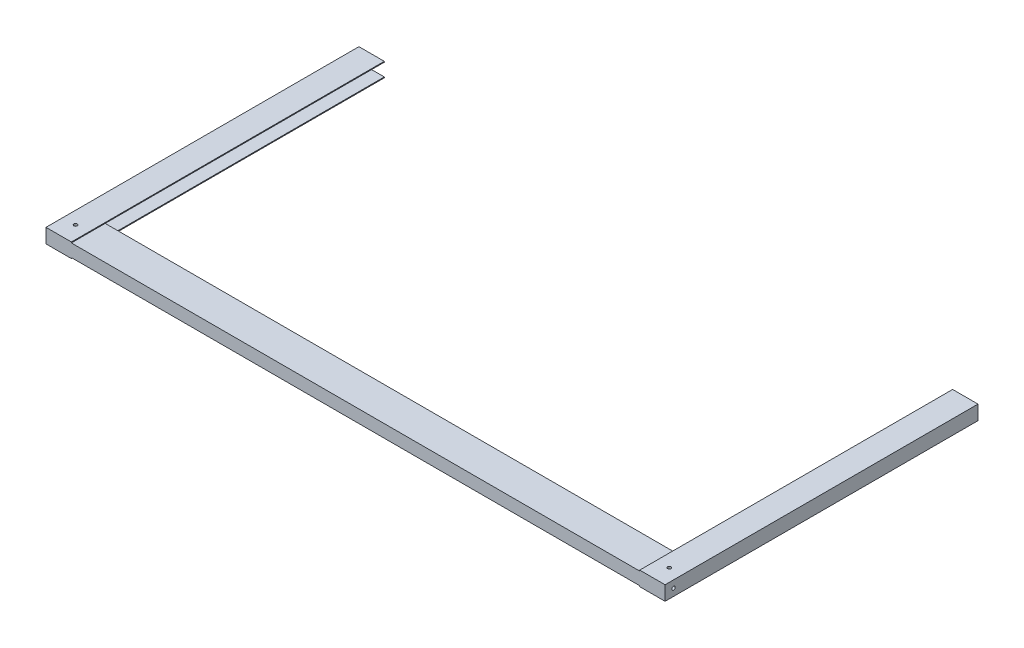
ISO-10303-21;
HEADER;
FILE_DESCRIPTION(('STEP AP214'),'2;1');
FILE_NAME('part.step','',(''),(''),'','','');
FILE_SCHEMA(('AUTOMOTIVE_DESIGN { 1 0 10303 214 1 1 1 1 }'));
ENDSEC;
DATA;
#1=APPLICATION_CONTEXT('core data for automotive mechanical design processes');
#2=APPLICATION_PROTOCOL_DEFINITION('international standard','automotive_design',2000,#1);
#3=PRODUCT_CONTEXT('',#1,'mechanical');
#4=PRODUCT('Part','Part','',(#3));
#5=PRODUCT_RELATED_PRODUCT_CATEGORY('part','',(#4));
#6=PRODUCT_DEFINITION_FORMATION('','',#4);
#7=PRODUCT_DEFINITION_CONTEXT('part definition',#1,'design');
#8=PRODUCT_DEFINITION('design','',#6,#7);
#9=PRODUCT_DEFINITION_SHAPE('','',#8);
#10=(LENGTH_UNIT() NAMED_UNIT(*) SI_UNIT(.MILLI.,.METRE.));
#11=(NAMED_UNIT(*) PLANE_ANGLE_UNIT() SI_UNIT($,.RADIAN.));
#12=(NAMED_UNIT(*) SI_UNIT($,.STERADIAN.) SOLID_ANGLE_UNIT());
#13=UNCERTAINTY_MEASURE_WITH_UNIT(LENGTH_MEASURE(1.E-05),#10,'distance_accuracy_value','');
#14=(GEOMETRIC_REPRESENTATION_CONTEXT(3) GLOBAL_UNCERTAINTY_ASSIGNED_CONTEXT((#13)) GLOBAL_UNIT_ASSIGNED_CONTEXT((#10,
#11,#12)) REPRESENTATION_CONTEXT('',''));
#15=CARTESIAN_POINT('',(0.,0.,0.));
#16=DIRECTION('',(0.,0.,1.));
#17=DIRECTION('',(1.,0.,0.));
#18=AXIS2_PLACEMENT_3D('',#15,#16,#17);
#19=CARTESIAN_POINT('',(-365.000000000001,7.50000000000001,40.));
#20=DIRECTION('',(0.,-1.,0.));
#21=DIRECTION('',(0.,0.,-1.));
#22=AXIS2_PLACEMENT_3D('',#19,#20,#21);
#23=PLANE('',#22);
#24=DIRECTION('',(-1.,0.,0.));
#25=VECTOR('',#24,1.);
#26=CARTESIAN_POINT('',(-365.000000000001,7.50000000000001,40.));
#27=LINE('',#26,#25);
#28=CARTESIAN_POINT('',(335.999999999999,7.50000000000001,40.));
#29=VERTEX_POINT('',#28);
#30=CARTESIAN_POINT('',(-336.000000000001,7.50000000000001,40.));
#31=VERTEX_POINT('',#30);
#32=EDGE_CURVE('E41',#29,#31,#27,.T.);
#33=ORIENTED_EDGE('',*,*,#32,.F.);
#34=DIRECTION('',(0.,0.,1.));
#35=VECTOR('',#34,1.);
#36=CARTESIAN_POINT('',(335.999999999999,7.50000000000001,-330.));
#37=LINE('',#36,#35);
#38=CARTESIAN_POINT('',(335.999999999999,7.50000000000001,0.));
#39=VERTEX_POINT('',#38);
#40=EDGE_CURVE('E227',#39,#29,#37,.T.);
#41=ORIENTED_EDGE('',*,*,#40,.F.);
#42=DIRECTION('',(-1.,0.,0.));
#43=VECTOR('',#42,1.);
#44=CARTESIAN_POINT('',(-365.000000000001,7.50000000000001,0.));
#45=LINE('',#44,#43);
#46=CARTESIAN_POINT('',(-336.000000000001,7.50000000000001,0.));
#47=VERTEX_POINT('',#46);
#48=EDGE_CURVE('E303',#39,#47,#45,.T.);
#49=ORIENTED_EDGE('',*,*,#48,.T.);
#50=DIRECTION('',(0.,0.,1.));
#51=VECTOR('',#50,1.);
#52=CARTESIAN_POINT('',(-336.000000000001,7.50000000000001,-330.));
#53=LINE('',#52,#51);
#54=EDGE_CURVE('E278',#47,#31,#53,.T.);
#55=ORIENTED_EDGE('',*,*,#54,.T.);
#56=EDGE_LOOP('',(#33,#41,#49,#55));
#57=FACE_BOUND('',#56,.T.);
#58=ADVANCED_FACE('F33',(#57),#23,.F.);
#59=CARTESIAN_POINT('',(-365.000000000001,-7.50000000000001,40.));
#60=DIRECTION('',(0.,1.,0.));
#61=DIRECTION('',(0.,0.,1.));
#62=AXIS2_PLACEMENT_3D('',#59,#60,#61);
#63=PLANE('',#62);
#64=DIRECTION('',(1.,0.,0.));
#65=VECTOR('',#64,1.);
#66=CARTESIAN_POINT('',(-365.000000000001,-7.50000000000001,0.));
#67=LINE('',#66,#65);
#68=CARTESIAN_POINT('',(-336.000000000001,-7.50000000000001,0.));
#69=VERTEX_POINT('',#68);
#70=CARTESIAN_POINT('',(335.999999999999,-7.50000000000001,0.));
#71=VERTEX_POINT('',#70);
#72=EDGE_CURVE('E307',#69,#71,#67,.T.);
#73=ORIENTED_EDGE('',*,*,#72,.T.);
#74=DIRECTION('',(0.,0.,1.));
#75=VECTOR('',#74,1.);
#76=CARTESIAN_POINT('',(335.999999999999,-7.50000000000001,-330.));
#77=LINE('',#76,#75);
#78=CARTESIAN_POINT('',(335.999999999999,-7.50000000000001,40.));
#79=VERTEX_POINT('',#78);
#80=EDGE_CURVE('E49',#71,#79,#77,.T.);
#81=ORIENTED_EDGE('',*,*,#80,.T.);
#82=DIRECTION('',(1.,0.,0.));
#83=VECTOR('',#82,1.);
#84=CARTESIAN_POINT('',(-365.000000000001,-7.50000000000001,40.));
#85=LINE('',#84,#83);
#86=CARTESIAN_POINT('',(-336.000000000001,-7.50000000000001,40.));
#87=VERTEX_POINT('',#86);
#88=EDGE_CURVE('E11',#87,#79,#85,.T.);
#89=ORIENTED_EDGE('',*,*,#88,.F.);
#90=DIRECTION('',(0.,0.,1.));
#91=VECTOR('',#90,1.);
#92=CARTESIAN_POINT('',(-336.000000000001,-7.50000000000001,-330.));
#93=LINE('',#92,#91);
#94=EDGE_CURVE('E288',#69,#87,#93,.T.);
#95=ORIENTED_EDGE('',*,*,#94,.F.);
#96=EDGE_LOOP('',(#73,#81,#89,#95));
#97=FACE_BOUND('',#96,.T.);
#98=ADVANCED_FACE('F354',(#97),#63,.F.);
#99=CARTESIAN_POINT('',(0.,0.,40.));
#100=DIRECTION('',(0.,0.,-1.));
#101=DIRECTION('',(-1.,0.,0.));
#102=AXIS2_PLACEMENT_3D('',#99,#100,#101);
#103=PLANE('',#102);
#104=ORIENTED_EDGE('',*,*,#88,.T.);
#105=DIRECTION('',(1.11022302462516E-13,-1.,0.));
#106=VECTOR('',#105,1.);
#107=CARTESIAN_POINT('',(335.999999999999,-8.50000000000001,40.));
#108=LINE('',#107,#106);
#109=CARTESIAN_POINT('',(335.999999999999,-8.50000000000001,40.));
#110=VERTEX_POINT('',#109);
#111=EDGE_CURVE('E207',#79,#110,#108,.T.);
#112=ORIENTED_EDGE('',*,*,#111,.T.);
#113=DIRECTION('',(1.,0.,0.));
#114=VECTOR('',#113,1.);
#115=CARTESIAN_POINT('',(335.999999999999,-8.50000000000001,40.));
#116=LINE('',#115,#114);
#117=CARTESIAN_POINT('',(365.999999999999,-8.50000000000001,40.));
#118=VERTEX_POINT('',#117);
#119=EDGE_CURVE('E210',#110,#118,#116,.T.);
#120=ORIENTED_EDGE('',*,*,#119,.T.);
#121=DIRECTION('',(0.,1.,0.));
#122=VECTOR('',#121,1.);
#123=CARTESIAN_POINT('',(365.999999999999,8.50000000000001,40.));
#124=LINE('',#123,#122);
#125=CARTESIAN_POINT('',(365.999999999999,8.50000000000001,40.));
#126=VERTEX_POINT('',#125);
#127=EDGE_CURVE('E214',#118,#126,#124,.T.);
#128=ORIENTED_EDGE('',*,*,#127,.T.);
#129=DIRECTION('',(-1.,0.,0.));
#130=VECTOR('',#129,1.);
#131=CARTESIAN_POINT('',(335.999999999999,8.50000000000001,40.));
#132=LINE('',#131,#130);
#133=CARTESIAN_POINT('',(335.999999999999,8.50000000000001,40.));
#134=VERTEX_POINT('',#133);
#135=EDGE_CURVE('E186',#126,#134,#132,.T.);
#136=ORIENTED_EDGE('',*,*,#135,.T.);
#137=DIRECTION('',(0.,-1.,0.));
#138=VECTOR('',#137,1.);
#139=CARTESIAN_POINT('',(335.999999999999,7.50000000000001,40.));
#140=LINE('',#139,#138);
#141=EDGE_CURVE('E183',#134,#29,#140,.T.);
#142=ORIENTED_EDGE('',*,*,#141,.T.);
#143=ORIENTED_EDGE('',*,*,#32,.T.);
#144=DIRECTION('',(0.,1.,0.));
#145=VECTOR('',#144,1.);
#146=CARTESIAN_POINT('',(-336.000000000001,8.50000000000001,40.));
#147=LINE('',#146,#145);
#148=CARTESIAN_POINT('',(-336.000000000001,8.50000000000001,40.));
#149=VERTEX_POINT('',#148);
#150=EDGE_CURVE('E220',#31,#149,#147,.T.);
#151=ORIENTED_EDGE('',*,*,#150,.T.);
#152=DIRECTION('',(-1.,0.,0.));
#153=VECTOR('',#152,1.);
#154=CARTESIAN_POINT('',(-366.000000000001,8.50000000000001,40.));
#155=LINE('',#154,#153);
#156=CARTESIAN_POINT('',(-366.000000000001,8.50000000000001,40.));
#157=VERTEX_POINT('',#156);
#158=EDGE_CURVE('E263',#149,#157,#155,.T.);
#159=ORIENTED_EDGE('',*,*,#158,.T.);
#160=DIRECTION('',(0.,-1.,0.));
#161=VECTOR('',#160,1.);
#162=CARTESIAN_POINT('',(-366.000000000001,-8.50000000000001,40.));
#163=LINE('',#162,#161);
#164=CARTESIAN_POINT('',(-366.000000000001,-8.50000000000001,40.));
#165=VERTEX_POINT('',#164);
#166=EDGE_CURVE('E266',#157,#165,#163,.T.);
#167=ORIENTED_EDGE('',*,*,#166,.T.);
#168=DIRECTION('',(1.,0.,0.));
#169=VECTOR('',#168,1.);
#170=CARTESIAN_POINT('',(-366.000000000001,-8.50000000000001,40.));
#171=LINE('',#170,#169);
#172=CARTESIAN_POINT('',(-336.000000000001,-8.50000000000001,40.));
#173=VERTEX_POINT('',#172);
#174=EDGE_CURVE('E269',#165,#173,#171,.T.);
#175=ORIENTED_EDGE('',*,*,#174,.T.);
#176=DIRECTION('',(0.,1.,0.));
#177=VECTOR('',#176,1.);
#178=CARTESIAN_POINT('',(-336.000000000001,-7.50000000000001,40.));
#179=LINE('',#178,#177);
#180=EDGE_CURVE('E239',#173,#87,#179,.T.);
#181=ORIENTED_EDGE('',*,*,#180,.T.);
#182=EDGE_LOOP('',(#104,#112,#120,#128,#136,#142,#143,#151,#159,#167,#175,#181));
#183=FACE_BOUND('',#182,.T.);
#184=ADVANCED_FACE('F358',(#183),#103,.F.);
#185=CARTESIAN_POINT('',(0.,0.,0.));
#186=DIRECTION('',(0.,0.,-1.));
#187=DIRECTION('',(-1.,0.,0.));
#188=AXIS2_PLACEMENT_3D('',#185,#186,#187);
#189=PLANE('',#188);
#190=DIRECTION('',(0.,1.,0.));
#191=VECTOR('',#190,1.);
#192=CARTESIAN_POINT('',(364.999999999999,-7.50000000000001,0.));
#193=LINE('',#192,#191);
#194=CARTESIAN_POINT('',(364.999999999999,-7.50000000000001,0.));
#195=VERTEX_POINT('',#194);
#196=CARTESIAN_POINT('',(364.999999999999,7.50000000000001,0.));
#197=VERTEX_POINT('',#196);
#198=EDGE_CURVE('E277',#195,#197,#193,.T.);
#199=ORIENTED_EDGE('',*,*,#198,.F.);
#200=EDGE_CURVE('E305',#71,#195,#67,.T.);
#201=ORIENTED_EDGE('',*,*,#200,.F.);
#202=ORIENTED_EDGE('',*,*,#72,.F.);
#203=CARTESIAN_POINT('',(-365.000000000001,-7.50000000000001,0.));
#204=VERTEX_POINT('',#203);
#205=EDGE_CURVE('E36',#204,#69,#67,.T.);
#206=ORIENTED_EDGE('',*,*,#205,.F.);
#207=DIRECTION('',(0.,-1.,0.));
#208=VECTOR('',#207,1.);
#209=CARTESIAN_POINT('',(-365.000000000001,-7.50000000000001,0.));
#210=LINE('',#209,#208);
#211=CARTESIAN_POINT('',(-365.000000000001,7.50000000000001,0.));
#212=VERTEX_POINT('',#211);
#213=EDGE_CURVE('E302',#212,#204,#210,.T.);
#214=ORIENTED_EDGE('',*,*,#213,.F.);
#215=EDGE_CURVE('E299',#47,#212,#45,.T.);
#216=ORIENTED_EDGE('',*,*,#215,.F.);
#217=ORIENTED_EDGE('',*,*,#48,.F.);
#218=EDGE_CURVE('E300',#197,#39,#45,.T.);
#219=ORIENTED_EDGE('',*,*,#218,.F.);
#220=EDGE_LOOP('',(#199,#201,#202,#206,#214,#216,#217,#219));
#221=FACE_BOUND('',#220,.T.);
#222=ADVANCED_FACE('F362',(#221),#189,.T.);
#223=CARTESIAN_POINT('',(-336.000000000001,8.50000000000001,-330.));
#224=DIRECTION('',(1.,0.,0.));
#225=DIRECTION('',(0.,0.,-1.));
#226=AXIS2_PLACEMENT_3D('',#223,#224,#225);
#227=PLANE('',#226);
#228=ORIENTED_EDGE('',*,*,#150,.F.);
#229=ORIENTED_EDGE('',*,*,#54,.F.);
#230=CARTESIAN_POINT('',(-336.000000000001,7.50000000000001,-330.));
#231=VERTEX_POINT('',#230);
#232=EDGE_CURVE('E274',#231,#47,#53,.T.);
#233=ORIENTED_EDGE('',*,*,#232,.F.);
#234=DIRECTION('',(0.,1.,0.));
#235=VECTOR('',#234,1.);
#236=CARTESIAN_POINT('',(-336.000000000001,8.50000000000001,-330.));
#237=LINE('',#236,#235);
#238=CARTESIAN_POINT('',(-336.000000000001,8.50000000000001,-330.));
#239=VERTEX_POINT('',#238);
#240=EDGE_CURVE('E235',#231,#239,#237,.T.);
#241=ORIENTED_EDGE('',*,*,#240,.T.);
#242=DIRECTION('',(0.,0.,1.));
#243=VECTOR('',#242,1.);
#244=CARTESIAN_POINT('',(-336.000000000001,8.50000000000001,-330.));
#245=LINE('',#244,#243);
#246=EDGE_CURVE('E260',#239,#149,#245,.T.);
#247=ORIENTED_EDGE('',*,*,#246,.T.);
#248=EDGE_LOOP('',(#228,#229,#233,#241,#247));
#249=FACE_BOUND('',#248,.T.);
#250=ADVANCED_FACE('F337',(#249),#227,.T.);
#251=CARTESIAN_POINT('',(-336.000000000001,7.50000000000001,-330.));
#252=DIRECTION('',(0.,-1.,0.));
#253=DIRECTION('',(0.,0.,-1.));
#254=AXIS2_PLACEMENT_3D('',#251,#252,#253);
#255=PLANE('',#254);
#256=ORIENTED_EDGE('',*,*,#232,.T.);
#257=ORIENTED_EDGE('',*,*,#215,.T.);
#258=DIRECTION('',(0.,0.,1.));
#259=VECTOR('',#258,1.);
#260=CARTESIAN_POINT('',(-365.000000000001,7.50000000000001,-330.));
#261=LINE('',#260,#259);
#262=CARTESIAN_POINT('',(-365.000000000001,7.50000000000001,-330.));
#263=VERTEX_POINT('',#262);
#264=EDGE_CURVE('E279',#263,#212,#261,.T.);
#265=ORIENTED_EDGE('',*,*,#264,.F.);
#266=DIRECTION('',(1.,0.,0.));
#267=VECTOR('',#266,1.);
#268=CARTESIAN_POINT('',(-336.000000000001,7.50000000000001,-330.));
#269=LINE('',#268,#267);
#270=EDGE_CURVE('E257',#263,#231,#269,.T.);
#271=ORIENTED_EDGE('',*,*,#270,.T.);
#272=EDGE_LOOP('',(#256,#257,#265,#271));
#273=FACE_BOUND('',#272,.T.);
#274=ADVANCED_FACE('F341',(#273),#255,.T.);
#275=CARTESIAN_POINT('',(-365.000000000001,7.50000000000001,-330.));
#276=DIRECTION('',(1.,0.,0.));
#277=DIRECTION('',(0.,0.,-1.));
#278=AXIS2_PLACEMENT_3D('',#275,#276,#277);
#279=PLANE('',#278);
#280=ORIENTED_EDGE('',*,*,#264,.T.);
#281=ORIENTED_EDGE('',*,*,#213,.T.);
#282=DIRECTION('',(0.,0.,1.));
#283=VECTOR('',#282,1.);
#284=CARTESIAN_POINT('',(-365.000000000001,-7.50000000000001,-330.));
#285=LINE('',#284,#283);
#286=CARTESIAN_POINT('',(-365.000000000001,-7.50000000000001,-330.));
#287=VERTEX_POINT('',#286);
#288=EDGE_CURVE('E282',#287,#204,#285,.T.);
#289=ORIENTED_EDGE('',*,*,#288,.F.);
#290=DIRECTION('',(0.,1.,0.));
#291=VECTOR('',#290,1.);
#292=CARTESIAN_POINT('',(-365.000000000001,7.50000000000001,-330.));
#293=LINE('',#292,#291);
#294=EDGE_CURVE('E254',#287,#263,#293,.T.);
#295=ORIENTED_EDGE('',*,*,#294,.T.);
#296=EDGE_LOOP('',(#280,#281,#289,#295));
#297=FACE_BOUND('',#296,.T.);
#298=ADVANCED_FACE('F344',(#297),#279,.T.);
#299=CARTESIAN_POINT('',(-365.000000000001,-7.50000000000001,-330.));
#300=DIRECTION('',(0.,1.,0.));
#301=DIRECTION('',(0.,0.,1.));
#302=AXIS2_PLACEMENT_3D('',#299,#300,#301);
#303=PLANE('',#302);
#304=ORIENTED_EDGE('',*,*,#288,.T.);
#305=ORIENTED_EDGE('',*,*,#205,.T.);
#306=CARTESIAN_POINT('',(-336.000000000001,-7.50000000000001,-330.));
#307=VERTEX_POINT('',#306);
#308=EDGE_CURVE('E285',#307,#69,#93,.T.);
#309=ORIENTED_EDGE('',*,*,#308,.F.);
#310=DIRECTION('',(-1.,0.,0.));
#311=VECTOR('',#310,1.);
#312=CARTESIAN_POINT('',(-365.000000000001,-7.50000000000001,-330.));
#313=LINE('',#312,#311);
#314=EDGE_CURVE('E251',#307,#287,#313,.T.);
#315=ORIENTED_EDGE('',*,*,#314,.T.);
#316=EDGE_LOOP('',(#304,#305,#309,#315));
#317=FACE_BOUND('',#316,.T.);
#318=ADVANCED_FACE('F310',(#317),#303,.T.);
#319=CARTESIAN_POINT('',(-336.000000000001,-7.50000000000001,-330.));
#320=DIRECTION('',(1.,0.,0.));
#321=DIRECTION('',(0.,0.,-1.));
#322=AXIS2_PLACEMENT_3D('',#319,#320,#321);
#323=PLANE('',#322);
#324=ORIENTED_EDGE('',*,*,#180,.F.);
#325=DIRECTION('',(0.,0.,1.));
#326=VECTOR('',#325,1.);
#327=CARTESIAN_POINT('',(-336.000000000001,-8.50000000000001,-330.));
#328=LINE('',#327,#326);
#329=CARTESIAN_POINT('',(-336.000000000001,-8.50000000000001,-330.));
#330=VERTEX_POINT('',#329);
#331=EDGE_CURVE('E289',#330,#173,#328,.T.);
#332=ORIENTED_EDGE('',*,*,#331,.F.);
#333=DIRECTION('',(0.,1.,0.));
#334=VECTOR('',#333,1.);
#335=CARTESIAN_POINT('',(-336.000000000001,-7.50000000000001,-330.));
#336=LINE('',#335,#334);
#337=EDGE_CURVE('E248',#330,#307,#336,.T.);
#338=ORIENTED_EDGE('',*,*,#337,.T.);
#339=ORIENTED_EDGE('',*,*,#308,.T.);
#340=ORIENTED_EDGE('',*,*,#94,.T.);
#341=EDGE_LOOP('',(#324,#332,#338,#339,#340));
#342=FACE_BOUND('',#341,.T.);
#343=ADVANCED_FACE('F316',(#342),#323,.T.);
#344=CARTESIAN_POINT('',(-366.000000000001,-8.50000000000001,-330.));
#345=DIRECTION('',(0.,-1.,0.));
#346=DIRECTION('',(0.,0.,-1.));
#347=AXIS2_PLACEMENT_3D('',#344,#345,#346);
#348=PLANE('',#347);
#349=ORIENTED_EDGE('',*,*,#174,.F.);
#350=DIRECTION('',(0.,0.,1.));
#351=VECTOR('',#350,1.);
#352=CARTESIAN_POINT('',(-366.000000000001,-8.50000000000001,-330.));
#353=LINE('',#352,#351);
#354=CARTESIAN_POINT('',(-366.000000000001,-8.50000000000001,-330.));
#355=VERTEX_POINT('',#354);
#356=EDGE_CURVE('E291',#355,#165,#353,.T.);
#357=ORIENTED_EDGE('',*,*,#356,.F.);
#358=DIRECTION('',(1.,0.,0.));
#359=VECTOR('',#358,1.);
#360=CARTESIAN_POINT('',(-366.000000000001,-8.50000000000001,-330.));
#361=LINE('',#360,#359);
#362=EDGE_CURVE('E245',#355,#330,#361,.T.);
#363=ORIENTED_EDGE('',*,*,#362,.T.);
#364=ORIENTED_EDGE('',*,*,#331,.T.);
#365=EDGE_LOOP('',(#349,#357,#363,#364));
#366=FACE_BOUND('',#365,.T.);
#367=ADVANCED_FACE('F327',(#366),#348,.T.);
#368=CARTESIAN_POINT('',(-366.000000000001,-8.50000000000001,-330.));
#369=DIRECTION('',(-1.,0.,0.));
#370=DIRECTION('',(0.,0.,1.));
#371=AXIS2_PLACEMENT_3D('',#368,#369,#370);
#372=PLANE('',#371);
#373=CARTESIAN_POINT('',(-366.000000000001,0.,30.));
#374=DIRECTION('',(-1.,0.,0.));
#375=DIRECTION('',(0.,0.,1.));
#376=AXIS2_PLACEMENT_3D('',#373,#374,#375);
#377=CIRCLE('',#376,2.);
#378=CARTESIAN_POINT('',(-366.000000000001,0.,32.));
#379=VERTEX_POINT('',#378);
#380=EDGE_CURVE('E627',#379,#379,#377,.T.);
#381=ORIENTED_EDGE('',*,*,#380,.F.);
#382=EDGE_LOOP('',(#381));
#383=FACE_BOUND('',#382,.T.);
#384=ORIENTED_EDGE('',*,*,#166,.F.);
#385=DIRECTION('',(0.,0.,1.));
#386=VECTOR('',#385,1.);
#387=CARTESIAN_POINT('',(-366.000000000001,8.50000000000001,-330.));
#388=LINE('',#387,#386);
#389=CARTESIAN_POINT('',(-366.000000000001,8.50000000000001,-330.));
#390=VERTEX_POINT('',#389);
#391=EDGE_CURVE('E293',#390,#157,#388,.T.);
#392=ORIENTED_EDGE('',*,*,#391,.F.);
#393=DIRECTION('',(0.,-1.,0.));
#394=VECTOR('',#393,1.);
#395=CARTESIAN_POINT('',(-366.000000000001,-8.50000000000001,-330.));
#396=LINE('',#395,#394);
#397=EDGE_CURVE('E242',#390,#355,#396,.T.);
#398=ORIENTED_EDGE('',*,*,#397,.T.);
#399=ORIENTED_EDGE('',*,*,#356,.T.);
#400=EDGE_LOOP('',(#384,#392,#398,#399));
#401=FACE_BOUND('',#400,.T.);
#402=ADVANCED_FACE('F330',(#383,#401),#372,.T.);
#403=CARTESIAN_POINT('',(-366.000000000001,8.50000000000001,-330.));
#404=DIRECTION('',(0.,1.,0.));
#405=DIRECTION('',(0.,0.,1.));
#406=AXIS2_PLACEMENT_3D('',#403,#404,#405);
#407=PLANE('',#406);
#408=CARTESIAN_POINT('',(-351.000000000001,8.50000000000001,20.));
#409=DIRECTION('',(0.,1.,0.));
#410=DIRECTION('',(0.,0.,1.));
#411=AXIS2_PLACEMENT_3D('',#408,#409,#410);
#412=CIRCLE('',#411,2.);
#413=CARTESIAN_POINT('',(-351.000000000001,8.50000000000001,22.));
#414=VERTEX_POINT('',#413);
#415=EDGE_CURVE('E636',#414,#414,#412,.T.);
#416=ORIENTED_EDGE('',*,*,#415,.F.);
#417=EDGE_LOOP('',(#416));
#418=FACE_BOUND('',#417,.T.);
#419=ORIENTED_EDGE('',*,*,#158,.F.);
#420=ORIENTED_EDGE('',*,*,#246,.F.);
#421=DIRECTION('',(-1.,0.,0.));
#422=VECTOR('',#421,1.);
#423=CARTESIAN_POINT('',(-366.000000000001,8.50000000000001,-330.));
#424=LINE('',#423,#422);
#425=EDGE_CURVE('E238',#239,#390,#424,.T.);
#426=ORIENTED_EDGE('',*,*,#425,.T.);
#427=ORIENTED_EDGE('',*,*,#391,.T.);
#428=EDGE_LOOP('',(#419,#420,#426,#427));
#429=FACE_BOUND('',#428,.T.);
#430=ADVANCED_FACE('F334',(#418,#429),#407,.T.);
#431=CARTESIAN_POINT('',(0.,0.,-330.));
#432=DIRECTION('',(0.,0.,-1.));
#433=DIRECTION('',(-1.,0.,0.));
#434=AXIS2_PLACEMENT_3D('',#431,#432,#433);
#435=PLANE('',#434);
#436=ORIENTED_EDGE('',*,*,#240,.F.);
#437=ORIENTED_EDGE('',*,*,#270,.F.);
#438=ORIENTED_EDGE('',*,*,#294,.F.);
#439=ORIENTED_EDGE('',*,*,#314,.F.);
#440=ORIENTED_EDGE('',*,*,#337,.F.);
#441=ORIENTED_EDGE('',*,*,#362,.F.);
#442=ORIENTED_EDGE('',*,*,#397,.F.);
#443=ORIENTED_EDGE('',*,*,#425,.F.);
#444=EDGE_LOOP('',(#436,#437,#438,#439,#440,#441,#442,#443));
#445=FACE_BOUND('',#444,.T.);
#446=ADVANCED_FACE('F322',(#445),#435,.T.);
#447=CARTESIAN_POINT('',(335.999999999999,-7.50000000000001,-330.));
#448=DIRECTION('',(0.,1.,0.));
#449=DIRECTION('',(0.,0.,1.));
#450=AXIS2_PLACEMENT_3D('',#447,#448,#449);
#451=PLANE('',#450);
#452=CARTESIAN_POINT('',(335.999999999999,-7.50000000000001,-330.));
#453=VERTEX_POINT('',#452);
#454=EDGE_CURVE('E159',#453,#71,#77,.T.);
#455=ORIENTED_EDGE('',*,*,#454,.T.);
#456=ORIENTED_EDGE('',*,*,#200,.T.);
#457=DIRECTION('',(0.,0.,1.));
#458=VECTOR('',#457,1.);
#459=CARTESIAN_POINT('',(364.999999999999,-7.50000000000001,-330.));
#460=LINE('',#459,#458);
#461=CARTESIAN_POINT('',(364.999999999999,-7.50000000000001,-330.));
#462=VERTEX_POINT('',#461);
#463=EDGE_CURVE('E182',#462,#195,#460,.T.);
#464=ORIENTED_EDGE('',*,*,#463,.F.);
#465=DIRECTION('',(-1.,0.,0.));
#466=VECTOR('',#465,1.);
#467=CARTESIAN_POINT('',(335.999999999999,-7.50000000000001,-330.));
#468=LINE('',#467,#466);
#469=EDGE_CURVE('E174',#462,#453,#468,.T.);
#470=ORIENTED_EDGE('',*,*,#469,.T.);
#471=EDGE_LOOP('',(#455,#456,#464,#470));
#472=FACE_BOUND('',#471,.T.);
#473=ADVANCED_FACE('F180',(#472),#451,.T.);
#474=CARTESIAN_POINT('',(364.999999999999,-7.50000000000001,-330.));
#475=DIRECTION('',(-1.,0.,0.));
#476=DIRECTION('',(0.,-1.,0.));
#477=AXIS2_PLACEMENT_3D('',#474,#475,#476);
#478=PLANE('',#477);
#479=ORIENTED_EDGE('',*,*,#463,.T.);
#480=ORIENTED_EDGE('',*,*,#198,.T.);
#481=DIRECTION('',(0.,0.,1.));
#482=VECTOR('',#481,1.);
#483=CARTESIAN_POINT('',(364.999999999999,7.50000000000001,-330.));
#484=LINE('',#483,#482);
#485=CARTESIAN_POINT('',(364.999999999999,7.50000000000001,-330.));
#486=VERTEX_POINT('',#485);
#487=EDGE_CURVE('E221',#486,#197,#484,.T.);
#488=ORIENTED_EDGE('',*,*,#487,.F.);
#489=DIRECTION('',(0.,-1.,0.));
#490=VECTOR('',#489,1.);
#491=CARTESIAN_POINT('',(364.999999999999,-7.50000000000001,-330.));
#492=LINE('',#491,#490);
#493=EDGE_CURVE('E205',#486,#462,#492,.T.);
#494=ORIENTED_EDGE('',*,*,#493,.T.);
#495=EDGE_LOOP('',(#479,#480,#488,#494));
#496=FACE_BOUND('',#495,.T.);
#497=ADVANCED_FACE('F411',(#496),#478,.T.);
#498=CARTESIAN_POINT('',(364.999999999999,7.50000000000001,-330.));
#499=DIRECTION('',(0.,-1.,0.));
#500=DIRECTION('',(0.,0.,-1.));
#501=AXIS2_PLACEMENT_3D('',#498,#499,#500);
#502=PLANE('',#501);
#503=ORIENTED_EDGE('',*,*,#487,.T.);
#504=ORIENTED_EDGE('',*,*,#218,.T.);
#505=CARTESIAN_POINT('',(335.999999999999,7.50000000000001,-330.));
#506=VERTEX_POINT('',#505);
#507=EDGE_CURVE('E224',#506,#39,#37,.T.);
#508=ORIENTED_EDGE('',*,*,#507,.F.);
#509=DIRECTION('',(1.,0.,0.));
#510=VECTOR('',#509,1.);
#511=CARTESIAN_POINT('',(364.999999999999,7.50000000000001,-330.));
#512=LINE('',#511,#510);
#513=EDGE_CURVE('E202',#506,#486,#512,.T.);
#514=ORIENTED_EDGE('',*,*,#513,.T.);
#515=EDGE_LOOP('',(#503,#504,#508,#514));
#516=FACE_BOUND('',#515,.T.);
#517=ADVANCED_FACE('F418',(#516),#502,.T.);
#518=CARTESIAN_POINT('',(335.999999999999,7.50000000000001,-330.));
#519=DIRECTION('',(-1.,0.,0.));
#520=DIRECTION('',(0.,0.,1.));
#521=AXIS2_PLACEMENT_3D('',#518,#519,#520);
#522=PLANE('',#521);
#523=ORIENTED_EDGE('',*,*,#141,.F.);
#524=DIRECTION('',(0.,0.,1.));
#525=VECTOR('',#524,1.);
#526=CARTESIAN_POINT('',(335.999999999999,8.50000000000001,-330.));
#527=LINE('',#526,#525);
#528=CARTESIAN_POINT('',(335.999999999999,8.50000000000001,-330.));
#529=VERTEX_POINT('',#528);
#530=EDGE_CURVE('E228',#529,#134,#527,.T.);
#531=ORIENTED_EDGE('',*,*,#530,.F.);
#532=DIRECTION('',(0.,-1.,0.));
#533=VECTOR('',#532,1.);
#534=CARTESIAN_POINT('',(335.999999999999,7.50000000000001,-330.));
#535=LINE('',#534,#533);
#536=EDGE_CURVE('E199',#529,#506,#535,.T.);
#537=ORIENTED_EDGE('',*,*,#536,.T.);
#538=ORIENTED_EDGE('',*,*,#507,.T.);
#539=ORIENTED_EDGE('',*,*,#40,.T.);
#540=EDGE_LOOP('',(#523,#531,#537,#538,#539));
#541=FACE_BOUND('',#540,.T.);
#542=ADVANCED_FACE('F426',(#541),#522,.T.);
#543=CARTESIAN_POINT('',(335.999999999999,8.50000000000001,-330.));
#544=DIRECTION('',(0.,1.,0.));
#545=DIRECTION('',(0.,0.,1.));
#546=AXIS2_PLACEMENT_3D('',#543,#544,#545);
#547=PLANE('',#546);
#548=CARTESIAN_POINT('',(350.999999999999,8.50000000000001,20.));
#549=DIRECTION('',(0.,1.,0.));
#550=DIRECTION('',(0.,0.,1.));
#551=AXIS2_PLACEMENT_3D('',#548,#549,#550);
#552=CIRCLE('',#551,2.);
#553=CARTESIAN_POINT('',(350.999999999999,8.50000000000001,22.));
#554=VERTEX_POINT('',#553);
#555=EDGE_CURVE('E189',#554,#554,#552,.T.);
#556=ORIENTED_EDGE('',*,*,#555,.F.);
#557=EDGE_LOOP('',(#556));
#558=FACE_BOUND('',#557,.T.);
#559=ORIENTED_EDGE('',*,*,#135,.F.);
#560=DIRECTION('',(0.,0.,1.));
#561=VECTOR('',#560,1.);
#562=CARTESIAN_POINT('',(365.999999999999,8.50000000000001,-330.));
#563=LINE('',#562,#561);
#564=CARTESIAN_POINT('',(365.999999999999,8.50000000000001,-330.));
#565=VERTEX_POINT('',#564);
#566=EDGE_CURVE('E230',#565,#126,#563,.T.);
#567=ORIENTED_EDGE('',*,*,#566,.F.);
#568=DIRECTION('',(-1.,0.,0.));
#569=VECTOR('',#568,1.);
#570=CARTESIAN_POINT('',(335.999999999999,8.50000000000001,-330.));
#571=LINE('',#570,#569);
#572=EDGE_CURVE('E196',#565,#529,#571,.T.);
#573=ORIENTED_EDGE('',*,*,#572,.T.);
#574=ORIENTED_EDGE('',*,*,#530,.T.);
#575=EDGE_LOOP('',(#559,#567,#573,#574));
#576=FACE_BOUND('',#575,.T.);
#577=ADVANCED_FACE('F434',(#558,#576),#547,.T.);
#578=CARTESIAN_POINT('',(365.999999999999,8.50000000000001,-330.));
#579=DIRECTION('',(1.,0.,0.));
#580=DIRECTION('',(0.,0.,-1.));
#581=AXIS2_PLACEMENT_3D('',#578,#579,#580);
#582=PLANE('',#581);
#583=CARTESIAN_POINT('',(365.999999999999,0.,30.));
#584=DIRECTION('',(1.,0.,0.));
#585=DIRECTION('',(0.,0.,-1.));
#586=AXIS2_PLACEMENT_3D('',#583,#584,#585);
#587=CIRCLE('',#586,2.);
#588=CARTESIAN_POINT('',(365.999999999999,0.,28.));
#589=VERTEX_POINT('',#588);
#590=EDGE_CURVE('E626',#589,#589,#587,.T.);
#591=ORIENTED_EDGE('',*,*,#590,.F.);
#592=EDGE_LOOP('',(#591));
#593=FACE_BOUND('',#592,.T.);
#594=ORIENTED_EDGE('',*,*,#127,.F.);
#595=DIRECTION('',(0.,0.,1.));
#596=VECTOR('',#595,1.);
#597=CARTESIAN_POINT('',(365.999999999999,-8.50000000000001,-330.));
#598=LINE('',#597,#596);
#599=CARTESIAN_POINT('',(365.999999999999,-8.50000000000001,-330.));
#600=VERTEX_POINT('',#599);
#601=EDGE_CURVE('E232',#600,#118,#598,.T.);
#602=ORIENTED_EDGE('',*,*,#601,.F.);
#603=DIRECTION('',(0.,1.,0.));
#604=VECTOR('',#603,1.);
#605=CARTESIAN_POINT('',(365.999999999999,8.50000000000001,-330.));
#606=LINE('',#605,#604);
#607=EDGE_CURVE('E193',#600,#565,#606,.T.);
#608=ORIENTED_EDGE('',*,*,#607,.T.);
#609=ORIENTED_EDGE('',*,*,#566,.T.);
#610=EDGE_LOOP('',(#594,#602,#608,#609));
#611=FACE_BOUND('',#610,.T.);
#612=ADVANCED_FACE('F442',(#593,#611),#582,.T.);
#613=CARTESIAN_POINT('',(335.999999999999,-8.50000000000001,-330.));
#614=DIRECTION('',(0.,-1.,0.));
#615=DIRECTION('',(0.,0.,-1.));
#616=AXIS2_PLACEMENT_3D('',#613,#614,#615);
#617=PLANE('',#616);
#618=ORIENTED_EDGE('',*,*,#119,.F.);
#619=DIRECTION('',(0.,0.,1.));
#620=VECTOR('',#619,1.);
#621=CARTESIAN_POINT('',(335.999999999999,-8.50000000000001,-330.));
#622=LINE('',#621,#620);
#623=CARTESIAN_POINT('',(335.999999999999,-8.50000000000001,-330.));
#624=VERTEX_POINT('',#623);
#625=EDGE_CURVE('E167',#624,#110,#622,.T.);
#626=ORIENTED_EDGE('',*,*,#625,.F.);
#627=DIRECTION('',(1.,0.,0.));
#628=VECTOR('',#627,1.);
#629=CARTESIAN_POINT('',(335.999999999999,-8.50000000000001,-330.));
#630=LINE('',#629,#628);
#631=EDGE_CURVE('E178',#624,#600,#630,.T.);
#632=ORIENTED_EDGE('',*,*,#631,.T.);
#633=ORIENTED_EDGE('',*,*,#601,.T.);
#634=EDGE_LOOP('',(#618,#626,#632,#633));
#635=FACE_BOUND('',#634,.T.);
#636=ADVANCED_FACE('F451',(#635),#617,.T.);
#637=CARTESIAN_POINT('',(335.999999999999,-8.50000000000001,-330.));
#638=DIRECTION('',(-1.,-1.11022302462516E-13,0.));
#639=DIRECTION('',(1.11022302462516E-13,-1.,0.));
#640=AXIS2_PLACEMENT_3D('',#637,#638,#639);
#641=PLANE('',#640);
#642=ORIENTED_EDGE('',*,*,#111,.F.);
#643=ORIENTED_EDGE('',*,*,#80,.F.);
#644=ORIENTED_EDGE('',*,*,#454,.F.);
#645=DIRECTION('',(1.11022302462516E-13,-1.,0.));
#646=VECTOR('',#645,1.);
#647=CARTESIAN_POINT('',(335.999999999999,-8.50000000000001,-330.));
#648=LINE('',#647,#646);
#649=EDGE_CURVE('E163',#453,#624,#648,.T.);
#650=ORIENTED_EDGE('',*,*,#649,.T.);
#651=ORIENTED_EDGE('',*,*,#625,.T.);
#652=EDGE_LOOP('',(#642,#643,#644,#650,#651));
#653=FACE_BOUND('',#652,.T.);
#654=ADVANCED_FACE('F162',(#653),#641,.T.);
#655=CARTESIAN_POINT('',(0.,0.,-330.));
#656=DIRECTION('',(0.,0.,1.));
#657=DIRECTION('',(1.,0.,0.));
#658=AXIS2_PLACEMENT_3D('',#655,#656,#657);
#659=PLANE('',#658);
#660=ORIENTED_EDGE('',*,*,#469,.F.);
#661=ORIENTED_EDGE('',*,*,#493,.F.);
#662=ORIENTED_EDGE('',*,*,#513,.F.);
#663=ORIENTED_EDGE('',*,*,#536,.F.);
#664=ORIENTED_EDGE('',*,*,#572,.F.);
#665=ORIENTED_EDGE('',*,*,#607,.F.);
#666=ORIENTED_EDGE('',*,*,#631,.F.);
#667=ORIENTED_EDGE('',*,*,#649,.F.);
#668=EDGE_LOOP('',(#660,#661,#662,#663,#664,#665,#666,#667));
#669=FACE_BOUND('',#668,.T.);
#670=ADVANCED_FACE('F172',(#669),#659,.F.);
#671=CARTESIAN_POINT('',(350.999999999999,-1.49999999999999,20.));
#672=DIRECTION('',(0.,1.,0.));
#673=DIRECTION('',(0.,0.,1.));
#674=AXIS2_PLACEMENT_3D('',#671,#672,#673);
#675=CYLINDRICAL_SURFACE('',#674,2.);
#676=CARTESIAN_POINT('',(350.999999999999,-1.49999999999999,20.));
#677=DIRECTION('',(0.,1.,0.));
#678=DIRECTION('',(0.,0.,1.));
#679=AXIS2_PLACEMENT_3D('',#676,#677,#678);
#680=CIRCLE('',#679,2.);
#681=CARTESIAN_POINT('',(350.999999999999,-1.49999999999999,22.));
#682=VERTEX_POINT('',#681);
#683=EDGE_CURVE('E211',#682,#682,#680,.T.);
#684=ORIENTED_EDGE('',*,*,#683,.F.);
#685=EDGE_LOOP('',(#684));
#686=FACE_BOUND('',#685,.T.);
#687=ORIENTED_EDGE('',*,*,#555,.T.);
#688=EDGE_LOOP('',(#687));
#689=FACE_BOUND('',#688,.T.);
#690=ADVANCED_FACE('F472',(#686,#689),#675,.F.);
#691=CARTESIAN_POINT('',(350.999999999999,-1.49999999999999,20.));
#692=DIRECTION('',(0.,1.,0.));
#693=DIRECTION('',(0.,0.,1.));
#694=AXIS2_PLACEMENT_3D('',#691,#692,#693);
#695=PLANE('',#694);
#696=ORIENTED_EDGE('',*,*,#683,.T.);
#697=EDGE_LOOP('',(#696));
#698=FACE_BOUND('',#697,.T.);
#699=ADVANCED_FACE('F478',(#698),#695,.T.);
#700=CARTESIAN_POINT('',(-351.000000000001,-1.49999999999999,20.));
#701=DIRECTION('',(0.,1.,0.));
#702=DIRECTION('',(0.,0.,1.));
#703=AXIS2_PLACEMENT_3D('',#700,#701,#702);
#704=CYLINDRICAL_SURFACE('',#703,2.);
#705=CARTESIAN_POINT('',(-351.000000000001,-1.49999999999999,20.));
#706=DIRECTION('',(0.,1.,0.));
#707=DIRECTION('',(0.,0.,1.));
#708=AXIS2_PLACEMENT_3D('',#705,#706,#707);
#709=CIRCLE('',#708,2.);
#710=CARTESIAN_POINT('',(-351.000000000001,-1.49999999999999,22.));
#711=VERTEX_POINT('',#710);
#712=EDGE_CURVE('E638',#711,#711,#709,.T.);
#713=ORIENTED_EDGE('',*,*,#712,.F.);
#714=EDGE_LOOP('',(#713));
#715=FACE_BOUND('',#714,.T.);
#716=ORIENTED_EDGE('',*,*,#415,.T.);
#717=EDGE_LOOP('',(#716));
#718=FACE_BOUND('',#717,.T.);
#719=ADVANCED_FACE('F486',(#715,#718),#704,.F.);
#720=CARTESIAN_POINT('',(-351.000000000001,-1.49999999999999,20.));
#721=DIRECTION('',(0.,1.,0.));
#722=DIRECTION('',(0.,0.,1.));
#723=AXIS2_PLACEMENT_3D('',#720,#721,#722);
#724=PLANE('',#723);
#725=ORIENTED_EDGE('',*,*,#712,.T.);
#726=EDGE_LOOP('',(#725));
#727=FACE_BOUND('',#726,.T.);
#728=ADVANCED_FACE('F494',(#727),#724,.T.);
#729=CARTESIAN_POINT('',(355.999999999999,0.,30.));
#730=DIRECTION('',(1.,0.,0.));
#731=DIRECTION('',(0.,0.,-1.));
#732=AXIS2_PLACEMENT_3D('',#729,#730,#731);
#733=CYLINDRICAL_SURFACE('',#732,2.);
#734=CARTESIAN_POINT('',(355.999999999999,0.,30.));
#735=DIRECTION('',(1.,0.,0.));
#736=DIRECTION('',(0.,0.,-1.));
#737=AXIS2_PLACEMENT_3D('',#734,#735,#736);
#738=CIRCLE('',#737,2.);
#739=CARTESIAN_POINT('',(355.999999999999,0.,28.));
#740=VERTEX_POINT('',#739);
#741=EDGE_CURVE('E630',#740,#740,#738,.T.);
#742=ORIENTED_EDGE('',*,*,#741,.F.);
#743=EDGE_LOOP('',(#742));
#744=FACE_BOUND('',#743,.T.);
#745=ORIENTED_EDGE('',*,*,#590,.T.);
#746=EDGE_LOOP('',(#745));
#747=FACE_BOUND('',#746,.T.);
#748=ADVANCED_FACE('F501',(#744,#747),#733,.F.);
#749=CARTESIAN_POINT('',(355.999999999999,0.,30.));
#750=DIRECTION('',(1.,0.,0.));
#751=DIRECTION('',(0.,0.,-1.));
#752=AXIS2_PLACEMENT_3D('',#749,#750,#751);
#753=PLANE('',#752);
#754=ORIENTED_EDGE('',*,*,#741,.T.);
#755=EDGE_LOOP('',(#754));
#756=FACE_BOUND('',#755,.T.);
#757=ADVANCED_FACE('F508',(#756),#753,.T.);
#758=CARTESIAN_POINT('',(-356.000000000001,0.,30.));
#759=DIRECTION('',(-1.,0.,0.));
#760=DIRECTION('',(0.,0.,1.));
#761=AXIS2_PLACEMENT_3D('',#758,#759,#760);
#762=CYLINDRICAL_SURFACE('',#761,2.);
#763=CARTESIAN_POINT('',(-356.000000000001,0.,30.));
#764=DIRECTION('',(-1.,0.,0.));
#765=DIRECTION('',(0.,0.,1.));
#766=AXIS2_PLACEMENT_3D('',#763,#764,#765);
#767=CIRCLE('',#766,2.);
#768=CARTESIAN_POINT('',(-356.000000000001,0.,32.));
#769=VERTEX_POINT('',#768);
#770=EDGE_CURVE('E625',#769,#769,#767,.T.);
#771=ORIENTED_EDGE('',*,*,#770,.F.);
#772=EDGE_LOOP('',(#771));
#773=FACE_BOUND('',#772,.T.);
#774=ORIENTED_EDGE('',*,*,#380,.T.);
#775=EDGE_LOOP('',(#774));
#776=FACE_BOUND('',#775,.T.);
#777=ADVANCED_FACE('F515',(#773,#776),#762,.F.);
#778=CARTESIAN_POINT('',(-356.000000000001,0.,30.));
#779=DIRECTION('',(-1.,0.,0.));
#780=DIRECTION('',(0.,0.,1.));
#781=AXIS2_PLACEMENT_3D('',#778,#779,#780);
#782=PLANE('',#781);
#783=ORIENTED_EDGE('',*,*,#770,.T.);
#784=EDGE_LOOP('',(#783));
#785=FACE_BOUND('',#784,.T.);
#786=ADVANCED_FACE('F522',(#785),#782,.T.);
#787=CLOSED_SHELL('',(#58,#98,#184,#222,#250,#274,#298,#318,#343,#367,#402,#430,#446,#473,#497,
#517,#542,#577,#612,#636,#654,#670,#690,#699,#719,#728,#748,#757,#777,#786));
#788=MANIFOLD_SOLID_BREP('B2',#787);
#789=ADVANCED_BREP_SHAPE_REPRESENTATION('',(#18,#788),#14);
#790=SHAPE_DEFINITION_REPRESENTATION(#9,#789);
ENDSEC;
END-ISO-10303-21;
